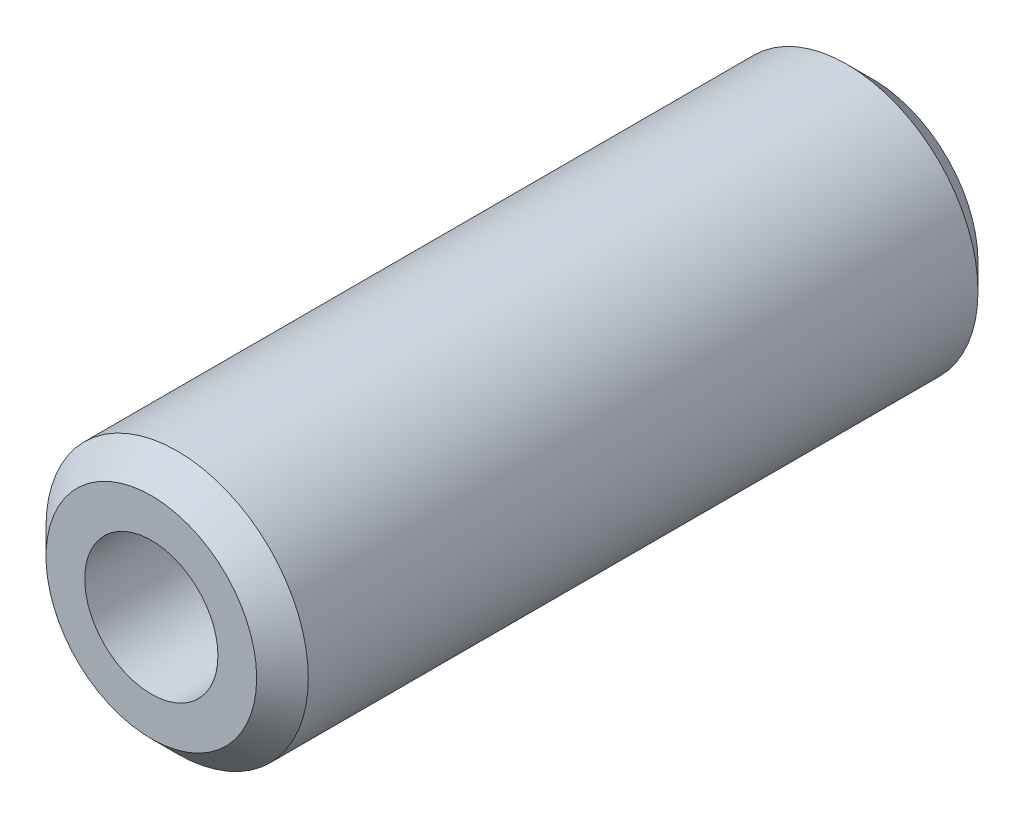
ISO-10303-21;
HEADER;
FILE_DESCRIPTION(('STEP AP214'),'2;1');
FILE_NAME('part.step','',(''),(''),'','','');
FILE_SCHEMA(('AUTOMOTIVE_DESIGN { 1 0 10303 214 1 1 1 1 }'));
ENDSEC;
DATA;
#1=APPLICATION_CONTEXT('core data for automotive mechanical design processes');
#2=APPLICATION_PROTOCOL_DEFINITION('international standard','automotive_design',2000,#1);
#3=PRODUCT_CONTEXT('',#1,'mechanical');
#4=PRODUCT('Part','Part','',(#3));
#5=PRODUCT_RELATED_PRODUCT_CATEGORY('part','',(#4));
#6=PRODUCT_DEFINITION_FORMATION('','',#4);
#7=PRODUCT_DEFINITION_CONTEXT('part definition',#1,'design');
#8=PRODUCT_DEFINITION('design','',#6,#7);
#9=PRODUCT_DEFINITION_SHAPE('','',#8);
#10=(LENGTH_UNIT() NAMED_UNIT(*) SI_UNIT(.MILLI.,.METRE.));
#11=(NAMED_UNIT(*) PLANE_ANGLE_UNIT() SI_UNIT($,.RADIAN.));
#12=(NAMED_UNIT(*) SI_UNIT($,.STERADIAN.) SOLID_ANGLE_UNIT());
#13=UNCERTAINTY_MEASURE_WITH_UNIT(LENGTH_MEASURE(1.E-05),#10,'distance_accuracy_value','');
#14=(GEOMETRIC_REPRESENTATION_CONTEXT(3) GLOBAL_UNCERTAINTY_ASSIGNED_CONTEXT((#13)) GLOBAL_UNIT_ASSIGNED_CONTEXT((#10,
#11,#12)) REPRESENTATION_CONTEXT('',''));
#15=CARTESIAN_POINT('',(0.,0.,0.));
#16=DIRECTION('',(0.,0.,1.));
#17=DIRECTION('',(1.,0.,0.));
#18=AXIS2_PLACEMENT_3D('',#15,#16,#17);
#19=CARTESIAN_POINT('',(0.,0.,69.85));
#20=DIRECTION('',(0.,0.,1.));
#21=DIRECTION('',(1.,0.,0.));
#22=AXIS2_PLACEMENT_3D('',#19,#20,#21);
#23=PLANE('',#22);
#24=CARTESIAN_POINT('',(0.,0.,69.85));
#25=DIRECTION('',(0.,0.,1.));
#26=DIRECTION('',(1.,0.,0.));
#27=AXIS2_PLACEMENT_3D('',#24,#25,#26);
#28=CIRCLE('',#27,10.2);
#29=CARTESIAN_POINT('',(10.2,0.,69.85));
#30=VERTEX_POINT('',#29);
#31=EDGE_CURVE('E53',#30,#30,#28,.T.);
#32=ORIENTED_EDGE('',*,*,#31,.T.);
#33=EDGE_LOOP('',(#32));
#34=FACE_BOUND('',#33,.T.);
#35=CARTESIAN_POINT('',(0.,0.,69.85));
#36=DIRECTION('',(0.,0.,1.));
#37=DIRECTION('',(1.,0.,0.));
#38=AXIS2_PLACEMENT_3D('',#35,#36,#37);
#39=CIRCLE('',#38,6.45);
#40=CARTESIAN_POINT('',(6.45,0.,69.85));
#41=VERTEX_POINT('',#40);
#42=EDGE_CURVE('E58',#41,#41,#39,.T.);
#43=ORIENTED_EDGE('',*,*,#42,.F.);
#44=EDGE_LOOP('',(#43));
#45=FACE_BOUND('',#44,.T.);
#46=ADVANCED_FACE('F37',(#34,#45),#23,.T.);
#47=CARTESIAN_POINT('',(0.,0.,0.));
#48=DIRECTION('',(0.,0.,1.));
#49=DIRECTION('',(1.,0.,0.));
#50=AXIS2_PLACEMENT_3D('',#47,#48,#49);
#51=PLANE('',#50);
#52=CARTESIAN_POINT('',(0.,0.,0.));
#53=DIRECTION('',(0.,0.,1.));
#54=DIRECTION('',(1.,0.,0.));
#55=AXIS2_PLACEMENT_3D('',#52,#53,#54);
#56=CIRCLE('',#55,10.2);
#57=CARTESIAN_POINT('',(10.2,0.,0.));
#58=VERTEX_POINT('',#57);
#59=EDGE_CURVE('E10',#58,#58,#56,.F.);
#60=ORIENTED_EDGE('',*,*,#59,.T.);
#61=EDGE_LOOP('',(#60));
#62=FACE_BOUND('',#61,.T.);
#63=CARTESIAN_POINT('',(0.,0.,0.));
#64=DIRECTION('',(0.,0.,1.));
#65=DIRECTION('',(1.,0.,0.));
#66=AXIS2_PLACEMENT_3D('',#63,#64,#65);
#67=CIRCLE('',#66,6.45);
#68=CARTESIAN_POINT('',(6.45,0.,0.));
#69=VERTEX_POINT('',#68);
#70=EDGE_CURVE('E59',#69,#69,#67,.T.);
#71=ORIENTED_EDGE('',*,*,#70,.T.);
#72=EDGE_LOOP('',(#71));
#73=FACE_BOUND('',#72,.T.);
#74=ADVANCED_FACE('F69',(#62,#73),#51,.F.);
#75=CARTESIAN_POINT('',(0.,0.,69.85));
#76=DIRECTION('',(0.,0.,-1.));
#77=DIRECTION('',(-1.,0.,0.));
#78=AXIS2_PLACEMENT_3D('',#75,#76,#77);
#79=CYLINDRICAL_SURFACE('',#78,12.7);
#80=CARTESIAN_POINT('',(0.,0.,67.35));
#81=DIRECTION('',(0.,0.,1.));
#82=DIRECTION('',(1.,0.,0.));
#83=AXIS2_PLACEMENT_3D('',#80,#81,#82);
#84=CIRCLE('',#83,12.7);
#85=CARTESIAN_POINT('',(12.7,0.,67.35));
#86=VERTEX_POINT('',#85);
#87=EDGE_CURVE('E45',#86,#86,#84,.F.);
#88=ORIENTED_EDGE('',*,*,#87,.T.);
#89=EDGE_LOOP('',(#88));
#90=FACE_BOUND('',#89,.T.);
#91=CARTESIAN_POINT('',(0.,0.,2.5));
#92=DIRECTION('',(0.,0.,1.));
#93=DIRECTION('',(1.,0.,0.));
#94=AXIS2_PLACEMENT_3D('',#91,#92,#93);
#95=CIRCLE('',#94,12.7);
#96=CARTESIAN_POINT('',(12.7,0.,2.5));
#97=VERTEX_POINT('',#96);
#98=EDGE_CURVE('E49',#97,#97,#95,.T.);
#99=ORIENTED_EDGE('',*,*,#98,.T.);
#100=EDGE_LOOP('',(#99));
#101=FACE_BOUND('',#100,.T.);
#102=ADVANCED_FACE('F76',(#90,#101),#79,.T.);
#103=CARTESIAN_POINT('',(0.,0.,69.85));
#104=DIRECTION('',(0.,0.,-1.));
#105=DIRECTION('',(-1.,0.,0.));
#106=AXIS2_PLACEMENT_3D('',#103,#104,#105);
#107=CYLINDRICAL_SURFACE('',#106,6.45);
#108=ORIENTED_EDGE('',*,*,#42,.T.);
#109=EDGE_LOOP('',(#108));
#110=FACE_BOUND('',#109,.T.);
#111=ORIENTED_EDGE('',*,*,#70,.F.);
#112=EDGE_LOOP('',(#111));
#113=FACE_BOUND('',#112,.T.);
#114=ADVANCED_FACE('F65',(#110,#113),#107,.F.);
#115=CARTESIAN_POINT('',(0.,0.,69.85));
#116=DIRECTION('',(0.,0.,-1.));
#117=DIRECTION('',(-1.,0.,0.));
#118=AXIS2_PLACEMENT_3D('',#115,#116,#117);
#119=CONICAL_SURFACE('',#118,10.2,0.785398163397448);
#120=ORIENTED_EDGE('',*,*,#87,.F.);
#121=EDGE_LOOP('',(#120));
#122=FACE_BOUND('',#121,.T.);
#123=ORIENTED_EDGE('',*,*,#31,.F.);
#124=EDGE_LOOP('',(#123));
#125=FACE_BOUND('',#124,.T.);
#126=ADVANCED_FACE('F82',(#122,#125),#119,.T.);
#127=CARTESIAN_POINT('',(0.,0.,2.5));
#128=DIRECTION('',(0.,0.,1.));
#129=DIRECTION('',(1.,0.,0.));
#130=AXIS2_PLACEMENT_3D('',#127,#128,#129);
#131=CONICAL_SURFACE('',#130,12.7,0.78539816339745);
#132=ORIENTED_EDGE('',*,*,#59,.F.);
#133=EDGE_LOOP('',(#132));
#134=FACE_BOUND('',#133,.T.);
#135=ORIENTED_EDGE('',*,*,#98,.F.);
#136=EDGE_LOOP('',(#135));
#137=FACE_BOUND('',#136,.T.);
#138=ADVANCED_FACE('F40',(#134,#137),#131,.T.);
#139=CLOSED_SHELL('',(#46,#74,#102,#114,#126,#138));
#140=MANIFOLD_SOLID_BREP('B2',#139);
#141=ADVANCED_BREP_SHAPE_REPRESENTATION('',(#18,#140),#14);
#142=SHAPE_DEFINITION_REPRESENTATION(#9,#141);
ENDSEC;
END-ISO-10303-21;
